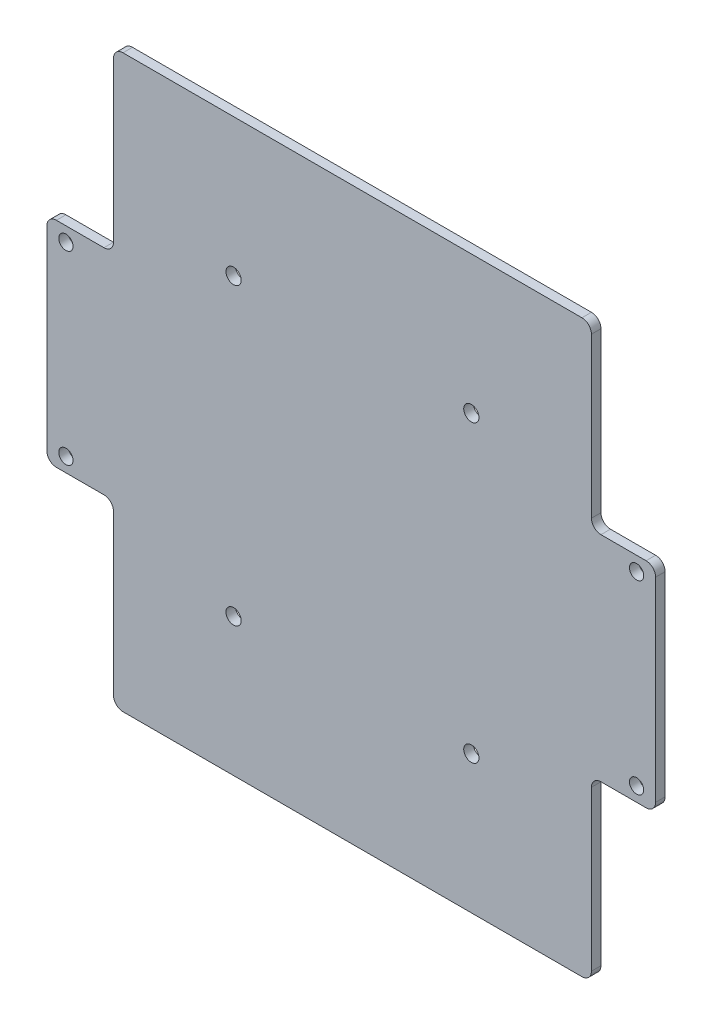
ISO-10303-21;
HEADER;
FILE_DESCRIPTION(('STEP AP214'),'2;1');
FILE_NAME('part.step','',(''),(''),'','','');
FILE_SCHEMA(('AUTOMOTIVE_DESIGN { 1 0 10303 214 1 1 1 1 }'));
ENDSEC;
DATA;
#1=APPLICATION_CONTEXT('core data for automotive mechanical design processes');
#2=APPLICATION_PROTOCOL_DEFINITION('international standard','automotive_design',2000,#1);
#3=PRODUCT_CONTEXT('',#1,'mechanical');
#4=PRODUCT('Part','Part','',(#3));
#5=PRODUCT_RELATED_PRODUCT_CATEGORY('part','',(#4));
#6=PRODUCT_DEFINITION_FORMATION('','',#4);
#7=PRODUCT_DEFINITION_CONTEXT('part definition',#1,'design');
#8=PRODUCT_DEFINITION('design','',#6,#7);
#9=PRODUCT_DEFINITION_SHAPE('','',#8);
#10=(LENGTH_UNIT() NAMED_UNIT(*) SI_UNIT(.MILLI.,.METRE.));
#11=(NAMED_UNIT(*) PLANE_ANGLE_UNIT() SI_UNIT($,.RADIAN.));
#12=(NAMED_UNIT(*) SI_UNIT($,.STERADIAN.) SOLID_ANGLE_UNIT());
#13=UNCERTAINTY_MEASURE_WITH_UNIT(LENGTH_MEASURE(1.E-05),#10,'distance_accuracy_value','');
#14=(GEOMETRIC_REPRESENTATION_CONTEXT(3) GLOBAL_UNCERTAINTY_ASSIGNED_CONTEXT((#13)) GLOBAL_UNIT_ASSIGNED_CONTEXT((#10,
#11,#12)) REPRESENTATION_CONTEXT('',''));
#15=CARTESIAN_POINT('',(0.,0.,0.));
#16=DIRECTION('',(0.,0.,1.));
#17=DIRECTION('',(1.,0.,0.));
#18=AXIS2_PLACEMENT_3D('',#15,#16,#17);
#19=CARTESIAN_POINT('',(0.,0.,2.));
#20=DIRECTION('',(0.,0.,1.));
#21=DIRECTION('',(1.,0.,0.));
#22=AXIS2_PLACEMENT_3D('',#19,#20,#21);
#23=PLANE('',#22);
#24=CARTESIAN_POINT('',(55.2539932196442,66.,2.));
#25=DIRECTION('',(0.,0.,1.));
#26=DIRECTION('',(1.,0.,0.));
#27=AXIS2_PLACEMENT_3D('',#24,#25,#26);
#28=CIRCLE('',#27,1.60000000000001);
#29=CARTESIAN_POINT('',(56.8539932196442,66.,2.));
#30=VERTEX_POINT('',#29);
#31=EDGE_CURVE('E321',#30,#30,#28,.T.);
#32=ORIENTED_EDGE('',*,*,#31,.F.);
#33=EDGE_LOOP('',(#32));
#34=FACE_BOUND('',#33,.T.);
#35=CARTESIAN_POINT('',(5.25399321964415,4.00000000000002,2.));
#36=DIRECTION('',(0.,0.,1.));
#37=DIRECTION('',(1.,0.,0.));
#38=AXIS2_PLACEMENT_3D('',#35,#36,#37);
#39=CIRCLE('',#38,1.6);
#40=CARTESIAN_POINT('',(6.85399321964415,4.00000000000002,2.));
#41=VERTEX_POINT('',#40);
#42=EDGE_CURVE('E322',#41,#41,#39,.T.);
#43=ORIENTED_EDGE('',*,*,#42,.F.);
#44=EDGE_LOOP('',(#43));
#45=FACE_BOUND('',#44,.T.);
#46=CARTESIAN_POINT('',(55.2539932196442,4.00000000000002,2.));
#47=DIRECTION('',(0.,0.,1.));
#48=DIRECTION('',(1.,0.,0.));
#49=AXIS2_PLACEMENT_3D('',#46,#47,#48);
#50=CIRCLE('',#49,1.60000000000001);
#51=CARTESIAN_POINT('',(56.8539932196442,4.00000000000002,2.));
#52=VERTEX_POINT('',#51);
#53=EDGE_CURVE('E331',#52,#52,#50,.T.);
#54=ORIENTED_EDGE('',*,*,#53,.F.);
#55=EDGE_LOOP('',(#54));
#56=FACE_BOUND('',#55,.T.);
#57=CARTESIAN_POINT('',(5.25399321964415,66.,2.));
#58=DIRECTION('',(0.,0.,1.));
#59=DIRECTION('',(1.,0.,0.));
#60=AXIS2_PLACEMENT_3D('',#57,#58,#59);
#61=CIRCLE('',#60,1.60000000000001);
#62=CARTESIAN_POINT('',(6.85399321964415,66.,2.));
#63=VERTEX_POINT('',#62);
#64=EDGE_CURVE('E314',#63,#63,#61,.T.);
#65=ORIENTED_EDGE('',*,*,#64,.F.);
#66=EDGE_LOOP('',(#65));
#67=FACE_BOUND('',#66,.T.);
#68=DIRECTION('',(-1.,0.,0.));
#69=VECTOR('',#68,1.);
#70=CARTESIAN_POINT('',(80.5079864392883,95.,2.));
#71=LINE('',#70,#69);
#72=CARTESIAN_POINT('',(78.5079864392883,95.,2.));
#73=VERTEX_POINT('',#72);
#74=CARTESIAN_POINT('',(-18.,95.,2.));
#75=VERTEX_POINT('',#74);
#76=EDGE_CURVE('E283',#73,#75,#71,.T.);
#77=ORIENTED_EDGE('',*,*,#76,.T.);
#78=CARTESIAN_POINT('',(-18.,93.,2.));
#79=DIRECTION('',(0.,0.,1.));
#80=DIRECTION('',(1.,0.,0.));
#81=AXIS2_PLACEMENT_3D('',#78,#79,#80);
#82=CIRCLE('',#81,2.);
#83=CARTESIAN_POINT('',(-20.,93.,2.));
#84=VERTEX_POINT('',#83);
#85=EDGE_CURVE('E299',#75,#84,#82,.T.);
#86=ORIENTED_EDGE('',*,*,#85,.T.);
#87=DIRECTION('',(0.,-1.,0.));
#88=VECTOR('',#87,1.);
#89=CARTESIAN_POINT('',(-20.,95.,2.));
#90=LINE('',#89,#88);
#91=CARTESIAN_POINT('',(-20.,59.5,2.));
#92=VERTEX_POINT('',#91);
#93=EDGE_CURVE('E282',#84,#92,#90,.T.);
#94=ORIENTED_EDGE('',*,*,#93,.T.);
#95=CARTESIAN_POINT('',(-22.,59.5,2.));
#96=DIRECTION('',(0.,0.,1.));
#97=DIRECTION('',(1.,0.,0.));
#98=AXIS2_PLACEMENT_3D('',#95,#96,#97);
#99=CIRCLE('',#98,2.);
#100=CARTESIAN_POINT('',(-22.,57.5,2.));
#101=VERTEX_POINT('',#100);
#102=EDGE_CURVE('E517',#92,#101,#99,.F.);
#103=ORIENTED_EDGE('',*,*,#102,.T.);
#104=DIRECTION('',(1.,0.,0.));
#105=VECTOR('',#104,1.);
#106=CARTESIAN_POINT('',(0.,57.5,2.));
#107=LINE('',#106,#105);
#108=CARTESIAN_POINT('',(-32.,57.5,2.));
#109=VERTEX_POINT('',#108);
#110=EDGE_CURVE('E264',#109,#101,#107,.T.);
#111=ORIENTED_EDGE('',*,*,#110,.F.);
#112=CARTESIAN_POINT('',(-32.,55.5,2.));
#113=DIRECTION('',(0.,0.,1.));
#114=DIRECTION('',(1.,0.,0.));
#115=AXIS2_PLACEMENT_3D('',#112,#113,#114);
#116=CIRCLE('',#115,2.);
#117=CARTESIAN_POINT('',(-34.,55.5,2.));
#118=VERTEX_POINT('',#117);
#119=EDGE_CURVE('E240',#109,#118,#116,.T.);
#120=ORIENTED_EDGE('',*,*,#119,.T.);
#121=DIRECTION('',(0.,1.,0.));
#122=VECTOR('',#121,1.);
#123=CARTESIAN_POINT('',(-34.,57.5,2.));
#124=LINE('',#123,#122);
#125=CARTESIAN_POINT('',(-34.,14.5,2.));
#126=VERTEX_POINT('',#125);
#127=EDGE_CURVE('E259',#126,#118,#124,.T.);
#128=ORIENTED_EDGE('',*,*,#127,.F.);
#129=CARTESIAN_POINT('',(-32.,14.5,2.));
#130=DIRECTION('',(0.,0.,1.));
#131=DIRECTION('',(1.,0.,0.));
#132=AXIS2_PLACEMENT_3D('',#129,#130,#131);
#133=CIRCLE('',#132,2.);
#134=CARTESIAN_POINT('',(-32.,12.5,2.));
#135=VERTEX_POINT('',#134);
#136=EDGE_CURVE('E244',#126,#135,#133,.T.);
#137=ORIENTED_EDGE('',*,*,#136,.T.);
#138=DIRECTION('',(-1.,0.,0.));
#139=VECTOR('',#138,1.);
#140=CARTESIAN_POINT('',(0.,12.5,2.));
#141=LINE('',#140,#139);
#142=CARTESIAN_POINT('',(-22.,12.5,2.));
#143=VERTEX_POINT('',#142);
#144=EDGE_CURVE('E219',#143,#135,#141,.T.);
#145=ORIENTED_EDGE('',*,*,#144,.F.);
#146=CARTESIAN_POINT('',(-22.,10.5,2.));
#147=DIRECTION('',(0.,0.,1.));
#148=DIRECTION('',(1.,0.,0.));
#149=AXIS2_PLACEMENT_3D('',#146,#147,#148);
#150=CIRCLE('',#149,2.);
#151=CARTESIAN_POINT('',(-20.,10.5,2.));
#152=VERTEX_POINT('',#151);
#153=EDGE_CURVE('E51',#143,#152,#150,.F.);
#154=ORIENTED_EDGE('',*,*,#153,.T.);
#155=CARTESIAN_POINT('',(-20.,-23.,2.));
#156=VERTEX_POINT('',#155);
#157=EDGE_CURVE('E276',#152,#156,#90,.T.);
#158=ORIENTED_EDGE('',*,*,#157,.T.);
#159=CARTESIAN_POINT('',(-18.,-23.,2.));
#160=DIRECTION('',(0.,0.,1.));
#161=DIRECTION('',(1.,0.,0.));
#162=AXIS2_PLACEMENT_3D('',#159,#160,#161);
#163=CIRCLE('',#162,2.);
#164=CARTESIAN_POINT('',(-18.,-25.,2.));
#165=VERTEX_POINT('',#164);
#166=EDGE_CURVE('E451',#156,#165,#163,.T.);
#167=ORIENTED_EDGE('',*,*,#166,.T.);
#168=DIRECTION('',(1.,0.,0.));
#169=VECTOR('',#168,1.);
#170=CARTESIAN_POINT('',(-20.,-25.,2.));
#171=LINE('',#170,#169);
#172=CARTESIAN_POINT('',(78.5079864392883,-25.,2.));
#173=VERTEX_POINT('',#172);
#174=EDGE_CURVE('E286',#165,#173,#171,.T.);
#175=ORIENTED_EDGE('',*,*,#174,.T.);
#176=CARTESIAN_POINT('',(78.5079864392883,-23.,2.));
#177=DIRECTION('',(0.,0.,1.));
#178=DIRECTION('',(1.,0.,0.));
#179=AXIS2_PLACEMENT_3D('',#176,#177,#178);
#180=CIRCLE('',#179,2.);
#181=CARTESIAN_POINT('',(80.5079864392883,-23.,2.));
#182=VERTEX_POINT('',#181);
#183=EDGE_CURVE('E454',#173,#182,#180,.T.);
#184=ORIENTED_EDGE('',*,*,#183,.T.);
#185=DIRECTION('',(0.,1.,0.));
#186=VECTOR('',#185,1.);
#187=CARTESIAN_POINT('',(80.5079864392883,-25.,2.));
#188=LINE('',#187,#186);
#189=CARTESIAN_POINT('',(80.5079864392883,10.5,2.));
#190=VERTEX_POINT('',#189);
#191=EDGE_CURVE('E350',#182,#190,#188,.T.);
#192=ORIENTED_EDGE('',*,*,#191,.T.);
#193=CARTESIAN_POINT('',(82.5079864392883,10.5,2.));
#194=DIRECTION('',(0.,0.,1.));
#195=DIRECTION('',(1.,0.,0.));
#196=AXIS2_PLACEMENT_3D('',#193,#194,#195);
#197=CIRCLE('',#196,2.);
#198=CARTESIAN_POINT('',(82.5079864392883,12.5,2.));
#199=VERTEX_POINT('',#198);
#200=EDGE_CURVE('E524',#190,#199,#197,.F.);
#201=ORIENTED_EDGE('',*,*,#200,.T.);
#202=DIRECTION('',(1.,0.,0.));
#203=VECTOR('',#202,1.);
#204=CARTESIAN_POINT('',(60.,12.5,2.));
#205=LINE('',#204,#203);
#206=CARTESIAN_POINT('',(92.,12.5,2.));
#207=VERTEX_POINT('',#206);
#208=EDGE_CURVE('E212',#199,#207,#205,.T.);
#209=ORIENTED_EDGE('',*,*,#208,.T.);
#210=CARTESIAN_POINT('',(92.,14.5,2.));
#211=DIRECTION('',(0.,0.,1.));
#212=DIRECTION('',(1.,0.,0.));
#213=AXIS2_PLACEMENT_3D('',#210,#211,#212);
#214=CIRCLE('',#213,2.);
#215=CARTESIAN_POINT('',(94.,14.5,2.));
#216=VERTEX_POINT('',#215);
#217=EDGE_CURVE('E376',#207,#216,#214,.T.);
#218=ORIENTED_EDGE('',*,*,#217,.T.);
#219=DIRECTION('',(0.,1.,0.));
#220=VECTOR('',#219,1.);
#221=CARTESIAN_POINT('',(94.,57.5,2.));
#222=LINE('',#221,#220);
#223=CARTESIAN_POINT('',(94.,55.5,2.));
#224=VERTEX_POINT('',#223);
#225=EDGE_CURVE('E370',#216,#224,#222,.T.);
#226=ORIENTED_EDGE('',*,*,#225,.T.);
#227=CARTESIAN_POINT('',(92.,55.5,2.));
#228=DIRECTION('',(0.,0.,1.));
#229=DIRECTION('',(1.,0.,0.));
#230=AXIS2_PLACEMENT_3D('',#227,#228,#229);
#231=CIRCLE('',#230,2.);
#232=CARTESIAN_POINT('',(92.,57.5,2.));
#233=VERTEX_POINT('',#232);
#234=EDGE_CURVE('E380',#224,#233,#231,.T.);
#235=ORIENTED_EDGE('',*,*,#234,.T.);
#236=DIRECTION('',(-1.,0.,0.));
#237=VECTOR('',#236,1.);
#238=CARTESIAN_POINT('',(60.,57.5,2.));
#239=LINE('',#238,#237);
#240=CARTESIAN_POINT('',(82.5079864392883,57.5,2.));
#241=VERTEX_POINT('',#240);
#242=EDGE_CURVE('E390',#233,#241,#239,.T.);
#243=ORIENTED_EDGE('',*,*,#242,.T.);
#244=CARTESIAN_POINT('',(82.5079864392883,59.5,2.));
#245=DIRECTION('',(0.,0.,1.));
#246=DIRECTION('',(1.,0.,0.));
#247=AXIS2_PLACEMENT_3D('',#244,#245,#246);
#248=CIRCLE('',#247,2.);
#249=CARTESIAN_POINT('',(80.5079864392883,59.5,2.));
#250=VERTEX_POINT('',#249);
#251=EDGE_CURVE('E522',#241,#250,#248,.F.);
#252=ORIENTED_EDGE('',*,*,#251,.T.);
#253=CARTESIAN_POINT('',(80.5079864392883,93.,2.));
#254=VERTEX_POINT('',#253);
#255=EDGE_CURVE('E345',#250,#254,#188,.T.);
#256=ORIENTED_EDGE('',*,*,#255,.T.);
#257=CARTESIAN_POINT('',(78.5079864392883,93.,2.));
#258=DIRECTION('',(0.,0.,1.));
#259=DIRECTION('',(1.,0.,0.));
#260=AXIS2_PLACEMENT_3D('',#257,#258,#259);
#261=CIRCLE('',#260,2.);
#262=EDGE_CURVE('E303',#254,#73,#261,.T.);
#263=ORIENTED_EDGE('',*,*,#262,.T.);
#264=EDGE_LOOP('',(#77,#86,#94,#103,#111,#120,#128,#137,#145,#154,#158,#167,#175,#184,#192,#201,
#209,#218,#226,#235,#243,#252,#256,#263));
#265=FACE_BOUND('',#264,.T.);
#266=CARTESIAN_POINT('',(-30.,15.5,2.));
#267=DIRECTION('',(0.,0.,1.));
#268=DIRECTION('',(1.,0.,0.));
#269=AXIS2_PLACEMENT_3D('',#266,#267,#268);
#270=CIRCLE('',#269,1.5);
#271=CARTESIAN_POINT('',(-28.5,15.5,2.));
#272=VERTEX_POINT('',#271);
#273=EDGE_CURVE('E638',#272,#272,#270,.F.);
#274=ORIENTED_EDGE('',*,*,#273,.T.);
#275=EDGE_LOOP('',(#274));
#276=FACE_BOUND('',#275,.T.);
#277=CARTESIAN_POINT('',(-30.,54.5,2.));
#278=DIRECTION('',(0.,0.,1.));
#279=DIRECTION('',(1.,0.,0.));
#280=AXIS2_PLACEMENT_3D('',#277,#278,#279);
#281=CIRCLE('',#280,1.5);
#282=CARTESIAN_POINT('',(-28.5,54.5,2.));
#283=VERTEX_POINT('',#282);
#284=EDGE_CURVE('E626',#283,#283,#281,.F.);
#285=ORIENTED_EDGE('',*,*,#284,.T.);
#286=EDGE_LOOP('',(#285));
#287=FACE_BOUND('',#286,.T.);
#288=CARTESIAN_POINT('',(90.,15.5,2.));
#289=DIRECTION('',(0.,0.,1.));
#290=DIRECTION('',(1.,0.,0.));
#291=AXIS2_PLACEMENT_3D('',#288,#289,#290);
#292=CIRCLE('',#291,1.5);
#293=CARTESIAN_POINT('',(91.5,15.5,2.));
#294=VERTEX_POINT('',#293);
#295=EDGE_CURVE('E630',#294,#294,#292,.F.);
#296=ORIENTED_EDGE('',*,*,#295,.T.);
#297=EDGE_LOOP('',(#296));
#298=FACE_BOUND('',#297,.T.);
#299=CARTESIAN_POINT('',(90.,54.5,2.));
#300=DIRECTION('',(0.,0.,1.));
#301=DIRECTION('',(1.,0.,0.));
#302=AXIS2_PLACEMENT_3D('',#299,#300,#301);
#303=CIRCLE('',#302,1.5);
#304=CARTESIAN_POINT('',(91.5,54.5,2.));
#305=VERTEX_POINT('',#304);
#306=EDGE_CURVE('E634',#305,#305,#303,.F.);
#307=ORIENTED_EDGE('',*,*,#306,.T.);
#308=EDGE_LOOP('',(#307));
#309=FACE_BOUND('',#308,.T.);
#310=ADVANCED_FACE('F43',(#34,#45,#56,#67,#265,#276,#287,#298,#309),#23,.T.);
#311=CARTESIAN_POINT('',(0.,0.,0.));
#312=DIRECTION('',(0.,0.,1.));
#313=DIRECTION('',(1.,0.,0.));
#314=AXIS2_PLACEMENT_3D('',#311,#312,#313);
#315=PLANE('',#314);
#316=CARTESIAN_POINT('',(55.2539932196442,66.,0.));
#317=DIRECTION('',(0.,0.,1.));
#318=DIRECTION('',(1.,0.,0.));
#319=AXIS2_PLACEMENT_3D('',#316,#317,#318);
#320=CIRCLE('',#319,1.60000000000001);
#321=CARTESIAN_POINT('',(56.8539932196442,66.,0.));
#322=VERTEX_POINT('',#321);
#323=EDGE_CURVE('E438',#322,#322,#320,.T.);
#324=ORIENTED_EDGE('',*,*,#323,.T.);
#325=EDGE_LOOP('',(#324));
#326=FACE_BOUND('',#325,.T.);
#327=CARTESIAN_POINT('',(5.25399321964415,4.00000000000002,0.));
#328=DIRECTION('',(0.,0.,1.));
#329=DIRECTION('',(1.,0.,0.));
#330=AXIS2_PLACEMENT_3D('',#327,#328,#329);
#331=CIRCLE('',#330,1.6);
#332=CARTESIAN_POINT('',(6.85399321964415,4.00000000000002,0.));
#333=VERTEX_POINT('',#332);
#334=EDGE_CURVE('E435',#333,#333,#331,.T.);
#335=ORIENTED_EDGE('',*,*,#334,.T.);
#336=EDGE_LOOP('',(#335));
#337=FACE_BOUND('',#336,.T.);
#338=CARTESIAN_POINT('',(55.2539932196442,4.00000000000002,0.));
#339=DIRECTION('',(0.,0.,1.));
#340=DIRECTION('',(1.,0.,0.));
#341=AXIS2_PLACEMENT_3D('',#338,#339,#340);
#342=CIRCLE('',#341,1.60000000000001);
#343=CARTESIAN_POINT('',(56.8539932196442,4.00000000000002,0.));
#344=VERTEX_POINT('',#343);
#345=EDGE_CURVE('E432',#344,#344,#342,.T.);
#346=ORIENTED_EDGE('',*,*,#345,.T.);
#347=EDGE_LOOP('',(#346));
#348=FACE_BOUND('',#347,.T.);
#349=CARTESIAN_POINT('',(5.25399321964415,66.,0.));
#350=DIRECTION('',(0.,0.,1.));
#351=DIRECTION('',(1.,0.,0.));
#352=AXIS2_PLACEMENT_3D('',#349,#350,#351);
#353=CIRCLE('',#352,1.60000000000001);
#354=CARTESIAN_POINT('',(6.85399321964415,66.,0.));
#355=VERTEX_POINT('',#354);
#356=EDGE_CURVE('E320',#355,#355,#353,.T.);
#357=ORIENTED_EDGE('',*,*,#356,.T.);
#358=EDGE_LOOP('',(#357));
#359=FACE_BOUND('',#358,.T.);
#360=CARTESIAN_POINT('',(-30.,15.5,0.));
#361=DIRECTION('',(0.,0.,1.));
#362=DIRECTION('',(1.,0.,0.));
#363=AXIS2_PLACEMENT_3D('',#360,#361,#362);
#364=CIRCLE('',#363,1.5);
#365=CARTESIAN_POINT('',(-28.5,15.5,0.));
#366=VERTEX_POINT('',#365);
#367=EDGE_CURVE('E617',#366,#366,#364,.T.);
#368=ORIENTED_EDGE('',*,*,#367,.T.);
#369=EDGE_LOOP('',(#368));
#370=FACE_BOUND('',#369,.T.);
#371=CARTESIAN_POINT('',(-30.,54.5,0.));
#372=DIRECTION('',(0.,0.,1.));
#373=DIRECTION('',(1.,0.,0.));
#374=AXIS2_PLACEMENT_3D('',#371,#372,#373);
#375=CIRCLE('',#374,1.5);
#376=CARTESIAN_POINT('',(-28.5,54.5,0.));
#377=VERTEX_POINT('',#376);
#378=EDGE_CURVE('E622',#377,#377,#375,.T.);
#379=ORIENTED_EDGE('',*,*,#378,.T.);
#380=EDGE_LOOP('',(#379));
#381=FACE_BOUND('',#380,.T.);
#382=DIRECTION('',(0.,-1.,0.));
#383=VECTOR('',#382,1.);
#384=CARTESIAN_POINT('',(-20.,95.,0.));
#385=LINE('',#384,#383);
#386=CARTESIAN_POINT('',(-20.,93.,0.));
#387=VERTEX_POINT('',#386);
#388=CARTESIAN_POINT('',(-20.,59.5,0.));
#389=VERTEX_POINT('',#388);
#390=EDGE_CURVE('E607',#387,#389,#385,.T.);
#391=ORIENTED_EDGE('',*,*,#390,.F.);
#392=CARTESIAN_POINT('',(-18.,93.,0.));
#393=DIRECTION('',(0.,0.,1.));
#394=DIRECTION('',(1.,0.,0.));
#395=AXIS2_PLACEMENT_3D('',#392,#393,#394);
#396=CIRCLE('',#395,2.);
#397=CARTESIAN_POINT('',(-18.,95.,0.));
#398=VERTEX_POINT('',#397);
#399=EDGE_CURVE('E485',#387,#398,#396,.F.);
#400=ORIENTED_EDGE('',*,*,#399,.T.);
#401=DIRECTION('',(-1.,0.,0.));
#402=VECTOR('',#401,1.);
#403=CARTESIAN_POINT('',(80.5079864392883,95.,0.));
#404=LINE('',#403,#402);
#405=CARTESIAN_POINT('',(78.5079864392883,95.,0.));
#406=VERTEX_POINT('',#405);
#407=EDGE_CURVE('E325',#406,#398,#404,.T.);
#408=ORIENTED_EDGE('',*,*,#407,.F.);
#409=CARTESIAN_POINT('',(78.5079864392883,93.,0.));
#410=DIRECTION('',(0.,0.,1.));
#411=DIRECTION('',(1.,0.,0.));
#412=AXIS2_PLACEMENT_3D('',#409,#410,#411);
#413=CIRCLE('',#412,2.);
#414=CARTESIAN_POINT('',(80.5079864392883,93.,0.));
#415=VERTEX_POINT('',#414);
#416=EDGE_CURVE('E481',#406,#415,#413,.F.);
#417=ORIENTED_EDGE('',*,*,#416,.T.);
#418=DIRECTION('',(0.,1.,0.));
#419=VECTOR('',#418,1.);
#420=CARTESIAN_POINT('',(80.5079864392883,-25.,0.));
#421=LINE('',#420,#419);
#422=CARTESIAN_POINT('',(80.5079864392883,59.5,0.));
#423=VERTEX_POINT('',#422);
#424=EDGE_CURVE('E606',#423,#415,#421,.T.);
#425=ORIENTED_EDGE('',*,*,#424,.F.);
#426=CARTESIAN_POINT('',(82.5079864392883,59.5,0.));
#427=DIRECTION('',(0.,0.,1.));
#428=DIRECTION('',(1.,0.,0.));
#429=AXIS2_PLACEMENT_3D('',#426,#427,#428);
#430=CIRCLE('',#429,2.);
#431=CARTESIAN_POINT('',(82.5079864392883,57.5,0.));
#432=VERTEX_POINT('',#431);
#433=EDGE_CURVE('E520',#423,#432,#430,.T.);
#434=ORIENTED_EDGE('',*,*,#433,.T.);
#435=DIRECTION('',(-1.,0.,0.));
#436=VECTOR('',#435,1.);
#437=CARTESIAN_POINT('',(60.,57.5,0.));
#438=LINE('',#437,#436);
#439=CARTESIAN_POINT('',(92.,57.5,0.));
#440=VERTEX_POINT('',#439);
#441=EDGE_CURVE('E235',#440,#432,#438,.T.);
#442=ORIENTED_EDGE('',*,*,#441,.F.);
#443=CARTESIAN_POINT('',(92.,55.5,0.));
#444=DIRECTION('',(0.,0.,1.));
#445=DIRECTION('',(1.,0.,0.));
#446=AXIS2_PLACEMENT_3D('',#443,#444,#445);
#447=CIRCLE('',#446,2.);
#448=CARTESIAN_POINT('',(94.,55.5,0.));
#449=VERTEX_POINT('',#448);
#450=EDGE_CURVE('E233',#440,#449,#447,.F.);
#451=ORIENTED_EDGE('',*,*,#450,.T.);
#452=DIRECTION('',(0.,1.,0.));
#453=VECTOR('',#452,1.);
#454=CARTESIAN_POINT('',(94.,57.5,0.));
#455=LINE('',#454,#453);
#456=CARTESIAN_POINT('',(94.,14.5,0.));
#457=VERTEX_POINT('',#456);
#458=EDGE_CURVE('E400',#457,#449,#455,.T.);
#459=ORIENTED_EDGE('',*,*,#458,.F.);
#460=CARTESIAN_POINT('',(92.,14.5,0.));
#461=DIRECTION('',(0.,0.,1.));
#462=DIRECTION('',(1.,0.,0.));
#463=AXIS2_PLACEMENT_3D('',#460,#461,#462);
#464=CIRCLE('',#463,2.);
#465=CARTESIAN_POINT('',(92.,12.5,0.));
#466=VERTEX_POINT('',#465);
#467=EDGE_CURVE('E229',#457,#466,#464,.F.);
#468=ORIENTED_EDGE('',*,*,#467,.T.);
#469=DIRECTION('',(1.,0.,0.));
#470=VECTOR('',#469,1.);
#471=CARTESIAN_POINT('',(60.,12.5,0.));
#472=LINE('',#471,#470);
#473=CARTESIAN_POINT('',(82.5079864392883,12.5,0.));
#474=VERTEX_POINT('',#473);
#475=EDGE_CURVE('E394',#474,#466,#472,.T.);
#476=ORIENTED_EDGE('',*,*,#475,.F.);
#477=CARTESIAN_POINT('',(82.5079864392883,10.5,0.));
#478=DIRECTION('',(0.,0.,1.));
#479=DIRECTION('',(1.,0.,0.));
#480=AXIS2_PLACEMENT_3D('',#477,#478,#479);
#481=CIRCLE('',#480,2.);
#482=CARTESIAN_POINT('',(80.5079864392883,10.5,0.));
#483=VERTEX_POINT('',#482);
#484=EDGE_CURVE('E527',#474,#483,#481,.T.);
#485=ORIENTED_EDGE('',*,*,#484,.T.);
#486=CARTESIAN_POINT('',(80.5079864392883,-23.,0.));
#487=VERTEX_POINT('',#486);
#488=EDGE_CURVE('E601',#487,#483,#421,.T.);
#489=ORIENTED_EDGE('',*,*,#488,.F.);
#490=CARTESIAN_POINT('',(78.5079864392883,-23.,0.));
#491=DIRECTION('',(0.,0.,1.));
#492=DIRECTION('',(1.,0.,0.));
#493=AXIS2_PLACEMENT_3D('',#490,#491,#492);
#494=CIRCLE('',#493,2.);
#495=CARTESIAN_POINT('',(78.5079864392883,-25.,0.));
#496=VERTEX_POINT('',#495);
#497=EDGE_CURVE('E486',#487,#496,#494,.F.);
#498=ORIENTED_EDGE('',*,*,#497,.T.);
#499=DIRECTION('',(1.,0.,0.));
#500=VECTOR('',#499,1.);
#501=CARTESIAN_POINT('',(-20.,-25.,0.));
#502=LINE('',#501,#500);
#503=CARTESIAN_POINT('',(-18.,-25.,0.));
#504=VERTEX_POINT('',#503);
#505=EDGE_CURVE('E599',#504,#496,#502,.T.);
#506=ORIENTED_EDGE('',*,*,#505,.F.);
#507=CARTESIAN_POINT('',(-18.,-23.,0.));
#508=DIRECTION('',(0.,0.,1.));
#509=DIRECTION('',(1.,0.,0.));
#510=AXIS2_PLACEMENT_3D('',#507,#508,#509);
#511=CIRCLE('',#510,2.);
#512=CARTESIAN_POINT('',(-20.,-23.,0.));
#513=VERTEX_POINT('',#512);
#514=EDGE_CURVE('E62',#504,#513,#511,.F.);
#515=ORIENTED_EDGE('',*,*,#514,.T.);
#516=CARTESIAN_POINT('',(-20.,10.5,0.));
#517=VERTEX_POINT('',#516);
#518=EDGE_CURVE('E610',#517,#513,#385,.T.);
#519=ORIENTED_EDGE('',*,*,#518,.F.);
#520=CARTESIAN_POINT('',(-22.,10.5,0.));
#521=DIRECTION('',(0.,0.,1.));
#522=DIRECTION('',(1.,0.,0.));
#523=AXIS2_PLACEMENT_3D('',#520,#521,#522);
#524=CIRCLE('',#523,2.);
#525=CARTESIAN_POINT('',(-22.,12.5,0.));
#526=VERTEX_POINT('',#525);
#527=EDGE_CURVE('E12',#517,#526,#524,.T.);
#528=ORIENTED_EDGE('',*,*,#527,.T.);
#529=DIRECTION('',(-1.,0.,0.));
#530=VECTOR('',#529,1.);
#531=CARTESIAN_POINT('',(0.,12.5,0.));
#532=LINE('',#531,#530);
#533=CARTESIAN_POINT('',(-32.,12.5,0.));
#534=VERTEX_POINT('',#533);
#535=EDGE_CURVE('E200',#526,#534,#532,.T.);
#536=ORIENTED_EDGE('',*,*,#535,.T.);
#537=CARTESIAN_POINT('',(-32.,14.5,0.));
#538=DIRECTION('',(0.,0.,1.));
#539=DIRECTION('',(1.,0.,0.));
#540=AXIS2_PLACEMENT_3D('',#537,#538,#539);
#541=CIRCLE('',#540,2.);
#542=CARTESIAN_POINT('',(-34.,14.5,0.));
#543=VERTEX_POINT('',#542);
#544=EDGE_CURVE('E207',#534,#543,#541,.F.);
#545=ORIENTED_EDGE('',*,*,#544,.T.);
#546=DIRECTION('',(0.,1.,0.));
#547=VECTOR('',#546,1.);
#548=CARTESIAN_POINT('',(-34.,57.5,0.));
#549=LINE('',#548,#547);
#550=CARTESIAN_POINT('',(-34.,55.5,0.));
#551=VERTEX_POINT('',#550);
#552=EDGE_CURVE('E213',#543,#551,#549,.T.);
#553=ORIENTED_EDGE('',*,*,#552,.T.);
#554=CARTESIAN_POINT('',(-32.,55.5,0.));
#555=DIRECTION('',(0.,0.,1.));
#556=DIRECTION('',(1.,0.,0.));
#557=AXIS2_PLACEMENT_3D('',#554,#555,#556);
#558=CIRCLE('',#557,2.);
#559=CARTESIAN_POINT('',(-32.,57.5,0.));
#560=VERTEX_POINT('',#559);
#561=EDGE_CURVE('E230',#551,#560,#558,.F.);
#562=ORIENTED_EDGE('',*,*,#561,.T.);
#563=DIRECTION('',(1.,0.,0.));
#564=VECTOR('',#563,1.);
#565=CARTESIAN_POINT('',(0.,57.5,0.));
#566=LINE('',#565,#564);
#567=CARTESIAN_POINT('',(-22.,57.5,0.));
#568=VERTEX_POINT('',#567);
#569=EDGE_CURVE('E641',#560,#568,#566,.T.);
#570=ORIENTED_EDGE('',*,*,#569,.T.);
#571=CARTESIAN_POINT('',(-22.,59.5,0.));
#572=DIRECTION('',(0.,0.,1.));
#573=DIRECTION('',(1.,0.,0.));
#574=AXIS2_PLACEMENT_3D('',#571,#572,#573);
#575=CIRCLE('',#574,2.);
#576=EDGE_CURVE('E515',#568,#389,#575,.T.);
#577=ORIENTED_EDGE('',*,*,#576,.T.);
#578=EDGE_LOOP('',(#391,#400,#408,#417,#425,#434,#442,#451,#459,#468,#476,#485,#489,#498,#506,
#515,#519,#528,#536,#545,#553,#562,#570,#577));
#579=FACE_BOUND('',#578,.T.);
#580=CARTESIAN_POINT('',(90.,15.5,0.));
#581=DIRECTION('',(0.,0.,1.));
#582=DIRECTION('',(1.,0.,0.));
#583=AXIS2_PLACEMENT_3D('',#580,#581,#582);
#584=CIRCLE('',#583,1.5);
#585=CARTESIAN_POINT('',(91.5,15.5,0.));
#586=VERTEX_POINT('',#585);
#587=EDGE_CURVE('E351',#586,#586,#584,.T.);
#588=ORIENTED_EDGE('',*,*,#587,.T.);
#589=EDGE_LOOP('',(#588));
#590=FACE_BOUND('',#589,.T.);
#591=CARTESIAN_POINT('',(90.,54.5,0.));
#592=DIRECTION('',(0.,0.,1.));
#593=DIRECTION('',(1.,0.,0.));
#594=AXIS2_PLACEMENT_3D('',#591,#592,#593);
#595=CIRCLE('',#594,1.5);
#596=CARTESIAN_POINT('',(91.5,54.5,0.));
#597=VERTEX_POINT('',#596);
#598=EDGE_CURVE('E614',#597,#597,#595,.T.);
#599=ORIENTED_EDGE('',*,*,#598,.T.);
#600=EDGE_LOOP('',(#599));
#601=FACE_BOUND('',#600,.T.);
#602=ADVANCED_FACE('F203',(#326,#337,#348,#359,#370,#381,#579,#590,#601),#315,.F.);
#603=CARTESIAN_POINT('',(60.,57.5,0.));
#604=DIRECTION('',(0.,1.,0.));
#605=DIRECTION('',(0.,0.,1.));
#606=AXIS2_PLACEMENT_3D('',#603,#604,#605);
#607=PLANE('',#606);
#608=ORIENTED_EDGE('',*,*,#441,.T.);
#609=DIRECTION('',(0.,0.,-1.));
#610=VECTOR('',#609,1.);
#611=CARTESIAN_POINT('',(82.5079864392883,57.5,2.));
#612=LINE('',#611,#610);
#613=EDGE_CURVE('E494',#432,#241,#612,.F.);
#614=ORIENTED_EDGE('',*,*,#613,.T.);
#615=ORIENTED_EDGE('',*,*,#242,.F.);
#616=DIRECTION('',(0.,0.,1.));
#617=VECTOR('',#616,1.);
#618=CARTESIAN_POINT('',(92.,57.5,0.));
#619=LINE('',#618,#617);
#620=EDGE_CURVE('E385',#233,#440,#619,.F.);
#621=ORIENTED_EDGE('',*,*,#620,.T.);
#622=EDGE_LOOP('',(#608,#614,#615,#621));
#623=FACE_BOUND('',#622,.T.);
#624=ADVANCED_FACE('F549',(#623),#607,.T.);
#625=CARTESIAN_POINT('',(94.,57.5,0.));
#626=DIRECTION('',(1.,0.,0.));
#627=DIRECTION('',(0.,1.,0.));
#628=AXIS2_PLACEMENT_3D('',#625,#626,#627);
#629=PLANE('',#628);
#630=ORIENTED_EDGE('',*,*,#458,.T.);
#631=DIRECTION('',(0.,0.,1.));
#632=VECTOR('',#631,1.);
#633=CARTESIAN_POINT('',(94.,55.5,0.));
#634=LINE('',#633,#632);
#635=EDGE_CURVE('E415',#449,#224,#634,.T.);
#636=ORIENTED_EDGE('',*,*,#635,.T.);
#637=ORIENTED_EDGE('',*,*,#225,.F.);
#638=DIRECTION('',(0.,0.,1.));
#639=VECTOR('',#638,1.);
#640=CARTESIAN_POINT('',(94.,14.5,0.));
#641=LINE('',#640,#639);
#642=EDGE_CURVE('E412',#216,#457,#641,.F.);
#643=ORIENTED_EDGE('',*,*,#642,.T.);
#644=EDGE_LOOP('',(#630,#636,#637,#643));
#645=FACE_BOUND('',#644,.T.);
#646=ADVANCED_FACE('F411',(#645),#629,.T.);
#647=CARTESIAN_POINT('',(60.,12.5,0.));
#648=DIRECTION('',(0.,-1.,0.));
#649=DIRECTION('',(1.,0.,0.));
#650=AXIS2_PLACEMENT_3D('',#647,#648,#649);
#651=PLANE('',#650);
#652=ORIENTED_EDGE('',*,*,#208,.F.);
#653=DIRECTION('',(0.,0.,1.));
#654=VECTOR('',#653,1.);
#655=CARTESIAN_POINT('',(82.5079864392883,12.5,0.));
#656=LINE('',#655,#654);
#657=EDGE_CURVE('E501',#199,#474,#656,.F.);
#658=ORIENTED_EDGE('',*,*,#657,.T.);
#659=ORIENTED_EDGE('',*,*,#475,.T.);
#660=DIRECTION('',(0.,0.,1.));
#661=VECTOR('',#660,1.);
#662=CARTESIAN_POINT('',(92.,12.5,0.));
#663=LINE('',#662,#661);
#664=EDGE_CURVE('E223',#466,#207,#663,.T.);
#665=ORIENTED_EDGE('',*,*,#664,.T.);
#666=EDGE_LOOP('',(#652,#658,#659,#665));
#667=FACE_BOUND('',#666,.T.);
#668=ADVANCED_FACE('F555',(#667),#651,.T.);
#669=CARTESIAN_POINT('',(0.,12.5,0.));
#670=DIRECTION('',(0.,1.,0.));
#671=DIRECTION('',(-1.,0.,0.));
#672=AXIS2_PLACEMENT_3D('',#669,#670,#671);
#673=PLANE('',#672);
#674=ORIENTED_EDGE('',*,*,#535,.F.);
#675=DIRECTION('',(0.,0.,1.));
#676=VECTOR('',#675,1.);
#677=CARTESIAN_POINT('',(-22.,12.5,0.));
#678=LINE('',#677,#676);
#679=EDGE_CURVE('E513',#526,#143,#678,.T.);
#680=ORIENTED_EDGE('',*,*,#679,.T.);
#681=ORIENTED_EDGE('',*,*,#144,.T.);
#682=DIRECTION('',(0.,0.,1.));
#683=VECTOR('',#682,1.);
#684=CARTESIAN_POINT('',(-32.,12.5,0.));
#685=LINE('',#684,#683);
#686=EDGE_CURVE('E216',#135,#534,#685,.F.);
#687=ORIENTED_EDGE('',*,*,#686,.T.);
#688=EDGE_LOOP('',(#674,#680,#681,#687));
#689=FACE_BOUND('',#688,.T.);
#690=ADVANCED_FACE('F217',(#689),#673,.F.);
#691=CARTESIAN_POINT('',(-34.,57.5,0.));
#692=DIRECTION('',(1.,0.,0.));
#693=DIRECTION('',(0.,1.,0.));
#694=AXIS2_PLACEMENT_3D('',#691,#692,#693);
#695=PLANE('',#694);
#696=ORIENTED_EDGE('',*,*,#552,.F.);
#697=DIRECTION('',(0.,0.,1.));
#698=VECTOR('',#697,1.);
#699=CARTESIAN_POINT('',(-34.,14.5,0.));
#700=LINE('',#699,#698);
#701=EDGE_CURVE('E228',#543,#126,#700,.T.);
#702=ORIENTED_EDGE('',*,*,#701,.T.);
#703=ORIENTED_EDGE('',*,*,#127,.T.);
#704=DIRECTION('',(0.,0.,1.));
#705=VECTOR('',#704,1.);
#706=CARTESIAN_POINT('',(-34.,55.5,0.));
#707=LINE('',#706,#705);
#708=EDGE_CURVE('E222',#118,#551,#707,.F.);
#709=ORIENTED_EDGE('',*,*,#708,.T.);
#710=EDGE_LOOP('',(#696,#702,#703,#709));
#711=FACE_BOUND('',#710,.T.);
#712=ADVANCED_FACE('F660',(#711),#695,.F.);
#713=CARTESIAN_POINT('',(0.,57.5,0.));
#714=DIRECTION('',(0.,-1.,0.));
#715=DIRECTION('',(0.,0.,-1.));
#716=AXIS2_PLACEMENT_3D('',#713,#714,#715);
#717=PLANE('',#716);
#718=ORIENTED_EDGE('',*,*,#110,.T.);
#719=DIRECTION('',(0.,0.,-1.));
#720=VECTOR('',#719,1.);
#721=CARTESIAN_POINT('',(-22.,57.5,0.));
#722=LINE('',#721,#720);
#723=EDGE_CURVE('E429',#101,#568,#722,.T.);
#724=ORIENTED_EDGE('',*,*,#723,.T.);
#725=ORIENTED_EDGE('',*,*,#569,.F.);
#726=DIRECTION('',(0.,0.,1.));
#727=VECTOR('',#726,1.);
#728=CARTESIAN_POINT('',(-32.,57.5,0.));
#729=LINE('',#728,#727);
#730=EDGE_CURVE('E426',#560,#109,#729,.T.);
#731=ORIENTED_EDGE('',*,*,#730,.T.);
#732=EDGE_LOOP('',(#718,#724,#725,#731));
#733=FACE_BOUND('',#732,.T.);
#734=ADVANCED_FACE('F652',(#733),#717,.F.);
#735=CARTESIAN_POINT('',(-30.,54.5,3.));
#736=DIRECTION('',(0.,0.,-1.));
#737=DIRECTION('',(-1.,0.,0.));
#738=AXIS2_PLACEMENT_3D('',#735,#736,#737);
#739=CYLINDRICAL_SURFACE('',#738,1.5);
#740=ORIENTED_EDGE('',*,*,#284,.F.);
#741=EDGE_LOOP('',(#740));
#742=FACE_BOUND('',#741,.T.);
#743=ORIENTED_EDGE('',*,*,#378,.F.);
#744=EDGE_LOOP('',(#743));
#745=FACE_BOUND('',#744,.T.);
#746=ADVANCED_FACE('F667',(#742,#745),#739,.F.);
#747=CARTESIAN_POINT('',(90.,15.5,3.));
#748=DIRECTION('',(0.,0.,-1.));
#749=DIRECTION('',(-1.,0.,0.));
#750=AXIS2_PLACEMENT_3D('',#747,#748,#749);
#751=CYLINDRICAL_SURFACE('',#750,1.5);
#752=ORIENTED_EDGE('',*,*,#295,.F.);
#753=EDGE_LOOP('',(#752));
#754=FACE_BOUND('',#753,.T.);
#755=ORIENTED_EDGE('',*,*,#587,.F.);
#756=EDGE_LOOP('',(#755));
#757=FACE_BOUND('',#756,.T.);
#758=ADVANCED_FACE('F718',(#754,#757),#751,.F.);
#759=CARTESIAN_POINT('',(90.,54.5,3.));
#760=DIRECTION('',(0.,0.,-1.));
#761=DIRECTION('',(-1.,0.,0.));
#762=AXIS2_PLACEMENT_3D('',#759,#760,#761);
#763=CYLINDRICAL_SURFACE('',#762,1.5);
#764=ORIENTED_EDGE('',*,*,#306,.F.);
#765=EDGE_LOOP('',(#764));
#766=FACE_BOUND('',#765,.T.);
#767=ORIENTED_EDGE('',*,*,#598,.F.);
#768=EDGE_LOOP('',(#767));
#769=FACE_BOUND('',#768,.T.);
#770=ADVANCED_FACE('F721',(#766,#769),#763,.F.);
#771=CARTESIAN_POINT('',(-30.,15.5,3.));
#772=DIRECTION('',(0.,0.,-1.));
#773=DIRECTION('',(-1.,0.,0.));
#774=AXIS2_PLACEMENT_3D('',#771,#772,#773);
#775=CYLINDRICAL_SURFACE('',#774,1.5);
#776=ORIENTED_EDGE('',*,*,#273,.F.);
#777=EDGE_LOOP('',(#776));
#778=FACE_BOUND('',#777,.T.);
#779=ORIENTED_EDGE('',*,*,#367,.F.);
#780=EDGE_LOOP('',(#779));
#781=FACE_BOUND('',#780,.T.);
#782=ADVANCED_FACE('F561',(#778,#781),#775,.F.);
#783=CARTESIAN_POINT('',(92.,55.5,0.));
#784=DIRECTION('',(0.,0.,1.));
#785=DIRECTION('',(1.,0.,0.));
#786=AXIS2_PLACEMENT_3D('',#783,#784,#785);
#787=CYLINDRICAL_SURFACE('',#786,2.);
#788=ORIENTED_EDGE('',*,*,#450,.F.);
#789=ORIENTED_EDGE('',*,*,#620,.F.);
#790=ORIENTED_EDGE('',*,*,#234,.F.);
#791=ORIENTED_EDGE('',*,*,#635,.F.);
#792=EDGE_LOOP('',(#788,#789,#790,#791));
#793=FACE_BOUND('',#792,.T.);
#794=ADVANCED_FACE('F558',(#793),#787,.T.);
#795=CARTESIAN_POINT('',(92.,14.5,0.));
#796=DIRECTION('',(0.,0.,1.));
#797=DIRECTION('',(1.,0.,0.));
#798=AXIS2_PLACEMENT_3D('',#795,#796,#797);
#799=CYLINDRICAL_SURFACE('',#798,2.);
#800=ORIENTED_EDGE('',*,*,#467,.F.);
#801=ORIENTED_EDGE('',*,*,#642,.F.);
#802=ORIENTED_EDGE('',*,*,#217,.F.);
#803=ORIENTED_EDGE('',*,*,#664,.F.);
#804=EDGE_LOOP('',(#800,#801,#802,#803));
#805=FACE_BOUND('',#804,.T.);
#806=ADVANCED_FACE('F418',(#805),#799,.T.);
#807=CARTESIAN_POINT('',(-32.,14.5,0.));
#808=DIRECTION('',(0.,0.,1.));
#809=DIRECTION('',(1.,0.,0.));
#810=AXIS2_PLACEMENT_3D('',#807,#808,#809);
#811=CYLINDRICAL_SURFACE('',#810,2.);
#812=ORIENTED_EDGE('',*,*,#544,.F.);
#813=ORIENTED_EDGE('',*,*,#686,.F.);
#814=ORIENTED_EDGE('',*,*,#136,.F.);
#815=ORIENTED_EDGE('',*,*,#701,.F.);
#816=EDGE_LOOP('',(#812,#813,#814,#815));
#817=FACE_BOUND('',#816,.T.);
#818=ADVANCED_FACE('F226',(#817),#811,.T.);
#819=CARTESIAN_POINT('',(-32.,55.5,0.));
#820=DIRECTION('',(0.,0.,1.));
#821=DIRECTION('',(1.,0.,0.));
#822=AXIS2_PLACEMENT_3D('',#819,#820,#821);
#823=CYLINDRICAL_SURFACE('',#822,2.);
#824=ORIENTED_EDGE('',*,*,#561,.F.);
#825=ORIENTED_EDGE('',*,*,#708,.F.);
#826=ORIENTED_EDGE('',*,*,#119,.F.);
#827=ORIENTED_EDGE('',*,*,#730,.F.);
#828=EDGE_LOOP('',(#824,#825,#826,#827));
#829=FACE_BOUND('',#828,.T.);
#830=ADVANCED_FACE('F567',(#829),#823,.T.);
#831=CARTESIAN_POINT('',(80.5079864392883,95.,0.));
#832=DIRECTION('',(0.,1.,0.));
#833=DIRECTION('',(-1.,0.,0.));
#834=AXIS2_PLACEMENT_3D('',#831,#832,#833);
#835=PLANE('',#834);
#836=ORIENTED_EDGE('',*,*,#407,.T.);
#837=DIRECTION('',(0.,0.,1.));
#838=VECTOR('',#837,1.);
#839=CARTESIAN_POINT('',(-18.,95.,0.));
#840=LINE('',#839,#838);
#841=EDGE_CURVE('E449',#398,#75,#840,.T.);
#842=ORIENTED_EDGE('',*,*,#841,.T.);
#843=ORIENTED_EDGE('',*,*,#76,.F.);
#844=DIRECTION('',(0.,0.,1.));
#845=VECTOR('',#844,1.);
#846=CARTESIAN_POINT('',(78.5079864392883,95.,0.));
#847=LINE('',#846,#845);
#848=EDGE_CURVE('E447',#73,#406,#847,.F.);
#849=ORIENTED_EDGE('',*,*,#848,.T.);
#850=EDGE_LOOP('',(#836,#842,#843,#849));
#851=FACE_BOUND('',#850,.T.);
#852=ADVANCED_FACE('F475',(#851),#835,.T.);
#853=CARTESIAN_POINT('',(-20.,95.,0.));
#854=DIRECTION('',(-1.,0.,0.));
#855=DIRECTION('',(0.,-1.,0.));
#856=AXIS2_PLACEMENT_3D('',#853,#854,#855);
#857=PLANE('',#856);
#858=ORIENTED_EDGE('',*,*,#390,.T.);
#859=DIRECTION('',(0.,0.,-1.));
#860=VECTOR('',#859,1.);
#861=CARTESIAN_POINT('',(-20.,59.5,0.));
#862=LINE('',#861,#860);
#863=EDGE_CURVE('E445',#389,#92,#862,.F.);
#864=ORIENTED_EDGE('',*,*,#863,.T.);
#865=ORIENTED_EDGE('',*,*,#93,.F.);
#866=DIRECTION('',(0.,0.,1.));
#867=VECTOR('',#866,1.);
#868=CARTESIAN_POINT('',(-20.,93.,0.));
#869=LINE('',#868,#867);
#870=EDGE_CURVE('E443',#84,#387,#869,.F.);
#871=ORIENTED_EDGE('',*,*,#870,.T.);
#872=EDGE_LOOP('',(#858,#864,#865,#871));
#873=FACE_BOUND('',#872,.T.);
#874=ADVANCED_FACE('F694',(#873),#857,.T.);
#875=CARTESIAN_POINT('',(80.5079864392883,-25.,0.));
#876=DIRECTION('',(1.,0.,0.));
#877=DIRECTION('',(0.,1.,0.));
#878=AXIS2_PLACEMENT_3D('',#875,#876,#877);
#879=PLANE('',#878);
#880=ORIENTED_EDGE('',*,*,#424,.T.);
#881=DIRECTION('',(0.,0.,1.));
#882=VECTOR('',#881,1.);
#883=CARTESIAN_POINT('',(80.5079864392883,93.,0.));
#884=LINE('',#883,#882);
#885=EDGE_CURVE('E482',#415,#254,#884,.T.);
#886=ORIENTED_EDGE('',*,*,#885,.T.);
#887=ORIENTED_EDGE('',*,*,#255,.F.);
#888=DIRECTION('',(0.,0.,-1.));
#889=VECTOR('',#888,1.);
#890=CARTESIAN_POINT('',(80.5079864392883,59.5,0.));
#891=LINE('',#890,#889);
#892=EDGE_CURVE('E488',#250,#423,#891,.T.);
#893=ORIENTED_EDGE('',*,*,#892,.T.);
#894=EDGE_LOOP('',(#880,#886,#887,#893));
#895=FACE_BOUND('',#894,.T.);
#896=ADVANCED_FACE('F692',(#895),#879,.T.);
#897=CARTESIAN_POINT('',(-20.,-25.,0.));
#898=DIRECTION('',(0.,-1.,0.));
#899=DIRECTION('',(0.,0.,-1.));
#900=AXIS2_PLACEMENT_3D('',#897,#898,#899);
#901=PLANE('',#900);
#902=ORIENTED_EDGE('',*,*,#505,.T.);
#903=DIRECTION('',(0.,0.,1.));
#904=VECTOR('',#903,1.);
#905=CARTESIAN_POINT('',(78.5079864392883,-25.,0.));
#906=LINE('',#905,#904);
#907=EDGE_CURVE('E505',#496,#173,#906,.T.);
#908=ORIENTED_EDGE('',*,*,#907,.T.);
#909=ORIENTED_EDGE('',*,*,#174,.F.);
#910=DIRECTION('',(0.,0.,1.));
#911=VECTOR('',#910,1.);
#912=CARTESIAN_POINT('',(-18.,-25.,0.));
#913=LINE('',#912,#911);
#914=EDGE_CURVE('E503',#165,#504,#913,.F.);
#915=ORIENTED_EDGE('',*,*,#914,.T.);
#916=EDGE_LOOP('',(#902,#908,#909,#915));
#917=FACE_BOUND('',#916,.T.);
#918=ADVANCED_FACE('F603',(#917),#901,.T.);
#919=ORIENTED_EDGE('',*,*,#488,.T.);
#920=DIRECTION('',(0.,0.,1.));
#921=VECTOR('',#920,1.);
#922=CARTESIAN_POINT('',(80.5079864392883,10.5,2.));
#923=LINE('',#922,#921);
#924=EDGE_CURVE('E498',#483,#190,#923,.T.);
#925=ORIENTED_EDGE('',*,*,#924,.T.);
#926=ORIENTED_EDGE('',*,*,#191,.F.);
#927=DIRECTION('',(0.,0.,1.));
#928=VECTOR('',#927,1.);
#929=CARTESIAN_POINT('',(80.5079864392883,-23.,0.));
#930=LINE('',#929,#928);
#931=EDGE_CURVE('E496',#182,#487,#930,.F.);
#932=ORIENTED_EDGE('',*,*,#931,.T.);
#933=EDGE_LOOP('',(#919,#925,#926,#932));
#934=FACE_BOUND('',#933,.T.);
#935=ADVANCED_FACE('F696',(#934),#879,.T.);
#936=ORIENTED_EDGE('',*,*,#518,.T.);
#937=DIRECTION('',(0.,0.,1.));
#938=VECTOR('',#937,1.);
#939=CARTESIAN_POINT('',(-20.,-23.,0.));
#940=LINE('',#939,#938);
#941=EDGE_CURVE('E510',#513,#156,#940,.T.);
#942=ORIENTED_EDGE('',*,*,#941,.T.);
#943=ORIENTED_EDGE('',*,*,#157,.F.);
#944=DIRECTION('',(0.,0.,1.));
#945=VECTOR('',#944,1.);
#946=CARTESIAN_POINT('',(-20.,10.5,0.));
#947=LINE('',#946,#945);
#948=EDGE_CURVE('E508',#152,#517,#947,.F.);
#949=ORIENTED_EDGE('',*,*,#948,.T.);
#950=EDGE_LOOP('',(#936,#942,#943,#949));
#951=FACE_BOUND('',#950,.T.);
#952=ADVANCED_FACE('F534',(#951),#857,.T.);
#953=CARTESIAN_POINT('',(5.25399321964415,66.,-1.));
#954=DIRECTION('',(0.,0.,1.));
#955=DIRECTION('',(1.,0.,0.));
#956=AXIS2_PLACEMENT_3D('',#953,#954,#955);
#957=CYLINDRICAL_SURFACE('',#956,1.60000000000001);
#958=ORIENTED_EDGE('',*,*,#64,.T.);
#959=EDGE_LOOP('',(#958));
#960=FACE_BOUND('',#959,.T.);
#961=ORIENTED_EDGE('',*,*,#356,.F.);
#962=EDGE_LOOP('',(#961));
#963=FACE_BOUND('',#962,.T.);
#964=ADVANCED_FACE('F709',(#960,#963),#957,.F.);
#965=CARTESIAN_POINT('',(55.2539932196442,4.00000000000002,-1.));
#966=DIRECTION('',(0.,0.,1.));
#967=DIRECTION('',(1.,0.,0.));
#968=AXIS2_PLACEMENT_3D('',#965,#966,#967);
#969=CYLINDRICAL_SURFACE('',#968,1.60000000000001);
#970=ORIENTED_EDGE('',*,*,#53,.T.);
#971=EDGE_LOOP('',(#970));
#972=FACE_BOUND('',#971,.T.);
#973=ORIENTED_EDGE('',*,*,#345,.F.);
#974=EDGE_LOOP('',(#973));
#975=FACE_BOUND('',#974,.T.);
#976=ADVANCED_FACE('F713',(#972,#975),#969,.F.);
#977=CARTESIAN_POINT('',(5.25399321964415,4.00000000000002,-1.));
#978=DIRECTION('',(0.,0.,1.));
#979=DIRECTION('',(1.,0.,0.));
#980=AXIS2_PLACEMENT_3D('',#977,#978,#979);
#981=CYLINDRICAL_SURFACE('',#980,1.6);
#982=ORIENTED_EDGE('',*,*,#42,.T.);
#983=EDGE_LOOP('',(#982));
#984=FACE_BOUND('',#983,.T.);
#985=ORIENTED_EDGE('',*,*,#334,.F.);
#986=EDGE_LOOP('',(#985));
#987=FACE_BOUND('',#986,.T.);
#988=ADVANCED_FACE('F854',(#984,#987),#981,.F.);
#989=CARTESIAN_POINT('',(55.2539932196442,66.,-1.));
#990=DIRECTION('',(0.,0.,1.));
#991=DIRECTION('',(1.,0.,0.));
#992=AXIS2_PLACEMENT_3D('',#989,#990,#991);
#993=CYLINDRICAL_SURFACE('',#992,1.60000000000001);
#994=ORIENTED_EDGE('',*,*,#31,.T.);
#995=EDGE_LOOP('',(#994));
#996=FACE_BOUND('',#995,.T.);
#997=ORIENTED_EDGE('',*,*,#323,.F.);
#998=EDGE_LOOP('',(#997));
#999=FACE_BOUND('',#998,.T.);
#1000=ADVANCED_FACE('F575',(#996,#999),#993,.F.);
#1001=CARTESIAN_POINT('',(-22.,59.5,0.));
#1002=DIRECTION('',(0.,0.,-1.));
#1003=DIRECTION('',(-1.,0.,0.));
#1004=AXIS2_PLACEMENT_3D('',#1001,#1002,#1003);
#1005=CYLINDRICAL_SURFACE('',#1004,2.);
#1006=ORIENTED_EDGE('',*,*,#102,.F.);
#1007=ORIENTED_EDGE('',*,*,#863,.F.);
#1008=ORIENTED_EDGE('',*,*,#576,.F.);
#1009=ORIENTED_EDGE('',*,*,#723,.F.);
#1010=EDGE_LOOP('',(#1006,#1007,#1008,#1009));
#1011=FACE_BOUND('',#1010,.T.);
#1012=ADVANCED_FACE('F571',(#1011),#1005,.F.);
#1013=CARTESIAN_POINT('',(-18.,93.,0.));
#1014=DIRECTION('',(0.,0.,1.));
#1015=DIRECTION('',(1.,0.,0.));
#1016=AXIS2_PLACEMENT_3D('',#1013,#1014,#1015);
#1017=CYLINDRICAL_SURFACE('',#1016,2.);
#1018=ORIENTED_EDGE('',*,*,#399,.F.);
#1019=ORIENTED_EDGE('',*,*,#870,.F.);
#1020=ORIENTED_EDGE('',*,*,#85,.F.);
#1021=ORIENTED_EDGE('',*,*,#841,.F.);
#1022=EDGE_LOOP('',(#1018,#1019,#1020,#1021));
#1023=FACE_BOUND('',#1022,.T.);
#1024=ADVANCED_FACE('F574',(#1023),#1017,.T.);
#1025=CARTESIAN_POINT('',(78.5079864392883,93.,0.));
#1026=DIRECTION('',(0.,0.,1.));
#1027=DIRECTION('',(1.,0.,0.));
#1028=AXIS2_PLACEMENT_3D('',#1025,#1026,#1027);
#1029=CYLINDRICAL_SURFACE('',#1028,2.);
#1030=ORIENTED_EDGE('',*,*,#416,.F.);
#1031=ORIENTED_EDGE('',*,*,#848,.F.);
#1032=ORIENTED_EDGE('',*,*,#262,.F.);
#1033=ORIENTED_EDGE('',*,*,#885,.F.);
#1034=EDGE_LOOP('',(#1030,#1031,#1032,#1033));
#1035=FACE_BOUND('',#1034,.T.);
#1036=ADVANCED_FACE('F480',(#1035),#1029,.T.);
#1037=CARTESIAN_POINT('',(82.5079864392883,59.5,0.));
#1038=DIRECTION('',(0.,0.,1.));
#1039=DIRECTION('',(1.,0.,0.));
#1040=AXIS2_PLACEMENT_3D('',#1037,#1038,#1039);
#1041=CYLINDRICAL_SURFACE('',#1040,2.);
#1042=ORIENTED_EDGE('',*,*,#251,.F.);
#1043=ORIENTED_EDGE('',*,*,#613,.F.);
#1044=ORIENTED_EDGE('',*,*,#433,.F.);
#1045=ORIENTED_EDGE('',*,*,#892,.F.);
#1046=EDGE_LOOP('',(#1042,#1043,#1044,#1045));
#1047=FACE_BOUND('',#1046,.T.);
#1048=ADVANCED_FACE('F582',(#1047),#1041,.F.);
#1049=CARTESIAN_POINT('',(82.5079864392883,10.5,0.));
#1050=DIRECTION('',(0.,0.,-1.));
#1051=DIRECTION('',(-1.,0.,0.));
#1052=AXIS2_PLACEMENT_3D('',#1049,#1050,#1051);
#1053=CYLINDRICAL_SURFACE('',#1052,2.);
#1054=ORIENTED_EDGE('',*,*,#484,.F.);
#1055=ORIENTED_EDGE('',*,*,#657,.F.);
#1056=ORIENTED_EDGE('',*,*,#200,.F.);
#1057=ORIENTED_EDGE('',*,*,#924,.F.);
#1058=EDGE_LOOP('',(#1054,#1055,#1056,#1057));
#1059=FACE_BOUND('',#1058,.T.);
#1060=ADVANCED_FACE('F585',(#1059),#1053,.F.);
#1061=CARTESIAN_POINT('',(78.5079864392883,-23.,0.));
#1062=DIRECTION('',(0.,0.,1.));
#1063=DIRECTION('',(1.,0.,0.));
#1064=AXIS2_PLACEMENT_3D('',#1061,#1062,#1063);
#1065=CYLINDRICAL_SURFACE('',#1064,2.);
#1066=ORIENTED_EDGE('',*,*,#497,.F.);
#1067=ORIENTED_EDGE('',*,*,#931,.F.);
#1068=ORIENTED_EDGE('',*,*,#183,.F.);
#1069=ORIENTED_EDGE('',*,*,#907,.F.);
#1070=EDGE_LOOP('',(#1066,#1067,#1068,#1069));
#1071=FACE_BOUND('',#1070,.T.);
#1072=ADVANCED_FACE('F541',(#1071),#1065,.T.);
#1073=CARTESIAN_POINT('',(-18.,-23.,0.));
#1074=DIRECTION('',(0.,0.,1.));
#1075=DIRECTION('',(1.,0.,0.));
#1076=AXIS2_PLACEMENT_3D('',#1073,#1074,#1075);
#1077=CYLINDRICAL_SURFACE('',#1076,2.);
#1078=ORIENTED_EDGE('',*,*,#514,.F.);
#1079=ORIENTED_EDGE('',*,*,#914,.F.);
#1080=ORIENTED_EDGE('',*,*,#166,.F.);
#1081=ORIENTED_EDGE('',*,*,#941,.F.);
#1082=EDGE_LOOP('',(#1078,#1079,#1080,#1081));
#1083=FACE_BOUND('',#1082,.T.);
#1084=ADVANCED_FACE('F537',(#1083),#1077,.T.);
#1085=CARTESIAN_POINT('',(-22.,10.5,0.));
#1086=DIRECTION('',(0.,0.,1.));
#1087=DIRECTION('',(1.,0.,0.));
#1088=AXIS2_PLACEMENT_3D('',#1085,#1086,#1087);
#1089=CYLINDRICAL_SURFACE('',#1088,2.);
#1090=ORIENTED_EDGE('',*,*,#527,.F.);
#1091=ORIENTED_EDGE('',*,*,#948,.F.);
#1092=ORIENTED_EDGE('',*,*,#153,.F.);
#1093=ORIENTED_EDGE('',*,*,#679,.F.);
#1094=EDGE_LOOP('',(#1090,#1091,#1092,#1093));
#1095=FACE_BOUND('',#1094,.T.);
#1096=ADVANCED_FACE('F45',(#1095),#1089,.F.);
#1097=CLOSED_SHELL('',(#310,#602,#624,#646,#668,#690,#712,#734,#746,#758,#770,#782,#794,#806,
#818,#830,#852,#874,#896,#918,#935,#952,#964,#976,#988,#1000,#1012,#1024,#1036,#1048,#1060,
#1072,#1084,#1096));
#1098=MANIFOLD_SOLID_BREP('B2',#1097);
#1099=ADVANCED_BREP_SHAPE_REPRESENTATION('',(#18,#1098),#14);
#1100=SHAPE_DEFINITION_REPRESENTATION(#9,#1099);
ENDSEC;
END-ISO-10303-21;
